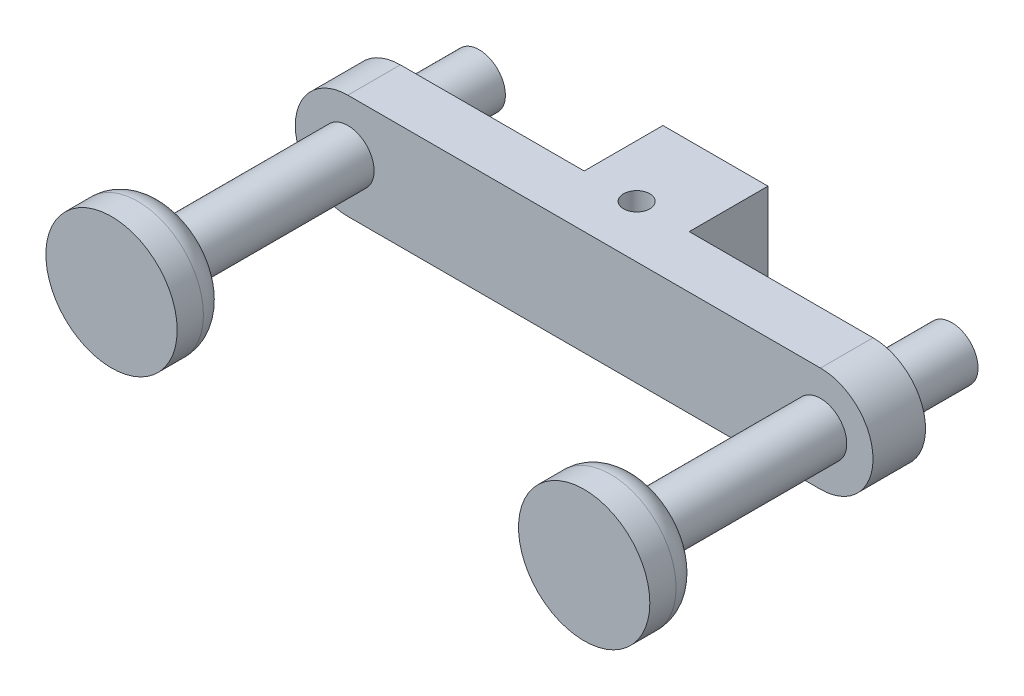
ISO-10303-21;
HEADER;
FILE_DESCRIPTION(('STEP AP214'),'2;1');
FILE_NAME('part.step','',(''),(''),'','','');
FILE_SCHEMA(('AUTOMOTIVE_DESIGN { 1 0 10303 214 1 1 1 1 }'));
ENDSEC;
DATA;
#1=APPLICATION_CONTEXT('core data for automotive mechanical design processes');
#2=APPLICATION_PROTOCOL_DEFINITION('international standard','automotive_design',2000,#1);
#3=PRODUCT_CONTEXT('',#1,'mechanical');
#4=PRODUCT('Part','Part','',(#3));
#5=PRODUCT_RELATED_PRODUCT_CATEGORY('part','',(#4));
#6=PRODUCT_DEFINITION_FORMATION('','',#4);
#7=PRODUCT_DEFINITION_CONTEXT('part definition',#1,'design');
#8=PRODUCT_DEFINITION('design','',#6,#7);
#9=PRODUCT_DEFINITION_SHAPE('','',#8);
#10=(LENGTH_UNIT() NAMED_UNIT(*) SI_UNIT(.MILLI.,.METRE.));
#11=(NAMED_UNIT(*) PLANE_ANGLE_UNIT() SI_UNIT($,.RADIAN.));
#12=(NAMED_UNIT(*) SI_UNIT($,.STERADIAN.) SOLID_ANGLE_UNIT());
#13=UNCERTAINTY_MEASURE_WITH_UNIT(LENGTH_MEASURE(1.E-05),#10,'distance_accuracy_value','');
#14=(GEOMETRIC_REPRESENTATION_CONTEXT(3) GLOBAL_UNCERTAINTY_ASSIGNED_CONTEXT((#13)) GLOBAL_UNIT_ASSIGNED_CONTEXT((#10,
#11,#12)) REPRESENTATION_CONTEXT('',''));
#15=CARTESIAN_POINT('',(0.,0.,0.));
#16=DIRECTION('',(0.,0.,1.));
#17=DIRECTION('',(1.,0.,0.));
#18=AXIS2_PLACEMENT_3D('',#15,#16,#17);
#19=CARTESIAN_POINT('',(-114.3,0.,0.));
#20=DIRECTION('',(0.,0.,1.));
#21=DIRECTION('',(1.,0.,0.));
#22=AXIS2_PLACEMENT_3D('',#19,#20,#21);
#23=PLANE('',#22);
#24=CARTESIAN_POINT('',(114.3,0.,0.));
#25=DIRECTION('',(0.,0.,1.));
#26=DIRECTION('',(1.,0.,0.));
#27=AXIS2_PLACEMENT_3D('',#24,#25,#26);
#28=CIRCLE('',#27,12.7);
#29=CARTESIAN_POINT('',(101.6,0.,0.));
#30=VERTEX_POINT('',#29);
#31=EDGE_CURVE('E264',#30,#30,#28,.T.);
#32=ORIENTED_EDGE('',*,*,#31,.T.);
#33=EDGE_LOOP('',(#32));
#34=FACE_BOUND('',#33,.T.);
#35=DIRECTION('',(0.,-1.,0.));
#36=VECTOR('',#35,1.);
#37=CARTESIAN_POINT('',(25.4,25.4,0.));
#38=LINE('',#37,#36);
#39=CARTESIAN_POINT('',(25.4,25.4,0.));
#40=VERTEX_POINT('',#39);
#41=CARTESIAN_POINT('',(25.4,-25.4,0.));
#42=VERTEX_POINT('',#41);
#43=EDGE_CURVE('E110',#40,#42,#38,.T.);
#44=ORIENTED_EDGE('',*,*,#43,.F.);
#45=DIRECTION('',(-1.,0.,0.));
#46=VECTOR('',#45,1.);
#47=CARTESIAN_POINT('',(-114.3,25.4,0.));
#48=LINE('',#47,#46);
#49=CARTESIAN_POINT('',(114.3,25.4,0.));
#50=VERTEX_POINT('',#49);
#51=EDGE_CURVE('E175',#50,#40,#48,.T.);
#52=ORIENTED_EDGE('',*,*,#51,.F.);
#53=CARTESIAN_POINT('',(114.3,0.,0.));
#54=DIRECTION('',(0.,0.,1.));
#55=DIRECTION('',(1.,0.,0.));
#56=AXIS2_PLACEMENT_3D('',#53,#54,#55);
#57=CIRCLE('',#56,25.4);
#58=CARTESIAN_POINT('',(114.3,-25.4,0.));
#59=VERTEX_POINT('',#58);
#60=EDGE_CURVE('E112',#59,#50,#57,.T.);
#61=ORIENTED_EDGE('',*,*,#60,.F.);
#62=DIRECTION('',(1.,0.,0.));
#63=VECTOR('',#62,1.);
#64=CARTESIAN_POINT('',(114.3,-25.4,0.));
#65=LINE('',#64,#63);
#66=EDGE_CURVE('E107',#42,#59,#65,.T.);
#67=ORIENTED_EDGE('',*,*,#66,.F.);
#68=EDGE_LOOP('',(#44,#52,#61,#67));
#69=FACE_BOUND('',#68,.T.);
#70=ADVANCED_FACE('F43',(#34,#69),#23,.F.);
#71=CARTESIAN_POINT('',(-114.3,0.,25.4));
#72=DIRECTION('',(0.,0.,1.));
#73=DIRECTION('',(1.,0.,0.));
#74=AXIS2_PLACEMENT_3D('',#71,#72,#73);
#75=PLANE('',#74);
#76=CARTESIAN_POINT('',(-114.3,0.,25.4));
#77=DIRECTION('',(0.,0.,1.));
#78=DIRECTION('',(1.,0.,0.));
#79=AXIS2_PLACEMENT_3D('',#76,#77,#78);
#80=CIRCLE('',#79,12.7);
#81=CARTESIAN_POINT('',(-127.,0.,25.4));
#82=VERTEX_POINT('',#81);
#83=EDGE_CURVE('E166',#82,#82,#80,.T.);
#84=ORIENTED_EDGE('',*,*,#83,.F.);
#85=EDGE_LOOP('',(#84));
#86=FACE_BOUND('',#85,.T.);
#87=CARTESIAN_POINT('',(-114.3,0.,25.4));
#88=DIRECTION('',(0.,0.,1.));
#89=DIRECTION('',(1.,0.,0.));
#90=AXIS2_PLACEMENT_3D('',#87,#88,#89);
#91=CIRCLE('',#90,25.4);
#92=CARTESIAN_POINT('',(-114.3,25.4,25.4));
#93=VERTEX_POINT('',#92);
#94=CARTESIAN_POINT('',(-114.3,-25.4,25.4));
#95=VERTEX_POINT('',#94);
#96=EDGE_CURVE('E170',#93,#95,#91,.T.);
#97=ORIENTED_EDGE('',*,*,#96,.T.);
#98=DIRECTION('',(1.,0.,0.));
#99=VECTOR('',#98,1.);
#100=CARTESIAN_POINT('',(114.3,-25.4,25.4));
#101=LINE('',#100,#99);
#102=CARTESIAN_POINT('',(114.3,-25.4,25.4));
#103=VERTEX_POINT('',#102);
#104=EDGE_CURVE('E174',#95,#103,#101,.T.);
#105=ORIENTED_EDGE('',*,*,#104,.T.);
#106=CARTESIAN_POINT('',(114.3,0.,25.4));
#107=DIRECTION('',(0.,0.,1.));
#108=DIRECTION('',(1.,0.,0.));
#109=AXIS2_PLACEMENT_3D('',#106,#107,#108);
#110=CIRCLE('',#109,25.4);
#111=CARTESIAN_POINT('',(114.3,25.4,25.4));
#112=VERTEX_POINT('',#111);
#113=EDGE_CURVE('E178',#103,#112,#110,.T.);
#114=ORIENTED_EDGE('',*,*,#113,.T.);
#115=DIRECTION('',(-1.,0.,0.));
#116=VECTOR('',#115,1.);
#117=CARTESIAN_POINT('',(-114.3,25.4,25.4));
#118=LINE('',#117,#116);
#119=EDGE_CURVE('E181',#112,#93,#118,.T.);
#120=ORIENTED_EDGE('',*,*,#119,.T.);
#121=EDGE_LOOP('',(#97,#105,#114,#120));
#122=FACE_BOUND('',#121,.T.);
#123=CARTESIAN_POINT('',(114.3,0.,25.4));
#124=DIRECTION('',(0.,0.,1.));
#125=DIRECTION('',(1.,0.,0.));
#126=AXIS2_PLACEMENT_3D('',#123,#124,#125);
#127=CIRCLE('',#126,12.7);
#128=CARTESIAN_POINT('',(101.6,0.,25.4));
#129=VERTEX_POINT('',#128);
#130=EDGE_CURVE('E162',#129,#129,#127,.T.);
#131=ORIENTED_EDGE('',*,*,#130,.F.);
#132=EDGE_LOOP('',(#131));
#133=FACE_BOUND('',#132,.T.);
#134=ADVANCED_FACE('F231',(#86,#122,#133),#75,.T.);
#135=CARTESIAN_POINT('',(-25.4,25.4,0.));
#136=VERTEX_POINT('',#135);
#137=CARTESIAN_POINT('',(-114.3,25.4,0.));
#138=VERTEX_POINT('',#137);
#139=EDGE_CURVE('E64',#136,#138,#48,.T.);
#140=ORIENTED_EDGE('',*,*,#139,.F.);
#141=DIRECTION('',(0.,-1.,0.));
#142=VECTOR('',#141,1.);
#143=CARTESIAN_POINT('',(-25.4,25.4,0.));
#144=LINE('',#143,#142);
#145=CARTESIAN_POINT('',(-25.4,-25.4,0.));
#146=VERTEX_POINT('',#145);
#147=EDGE_CURVE('E59',#136,#146,#144,.T.);
#148=ORIENTED_EDGE('',*,*,#147,.T.);
#149=CARTESIAN_POINT('',(-114.3,-25.4,0.));
#150=VERTEX_POINT('',#149);
#151=EDGE_CURVE('E118',#150,#146,#65,.T.);
#152=ORIENTED_EDGE('',*,*,#151,.F.);
#153=CARTESIAN_POINT('',(-114.3,0.,0.));
#154=DIRECTION('',(0.,0.,1.));
#155=DIRECTION('',(1.,0.,0.));
#156=AXIS2_PLACEMENT_3D('',#153,#154,#155);
#157=CIRCLE('',#156,25.4);
#158=EDGE_CURVE('E119',#138,#150,#157,.T.);
#159=ORIENTED_EDGE('',*,*,#158,.F.);
#160=EDGE_LOOP('',(#140,#148,#152,#159));
#161=FACE_BOUND('',#160,.T.);
#162=CARTESIAN_POINT('',(-114.3,0.,0.));
#163=DIRECTION('',(0.,0.,1.));
#164=DIRECTION('',(1.,0.,0.));
#165=AXIS2_PLACEMENT_3D('',#162,#163,#164);
#166=CIRCLE('',#165,12.7);
#167=CARTESIAN_POINT('',(-127.,0.,0.));
#168=VERTEX_POINT('',#167);
#169=EDGE_CURVE('E252',#168,#168,#166,.T.);
#170=ORIENTED_EDGE('',*,*,#169,.T.);
#171=EDGE_LOOP('',(#170));
#172=FACE_BOUND('',#171,.T.);
#173=ADVANCED_FACE('F234',(#161,#172),#23,.F.);
#174=CARTESIAN_POINT('',(-114.3,0.,25.4));
#175=DIRECTION('',(0.,0.,-1.));
#176=DIRECTION('',(-1.,0.,0.));
#177=AXIS2_PLACEMENT_3D('',#174,#175,#176);
#178=CYLINDRICAL_SURFACE('',#177,25.4);
#179=ORIENTED_EDGE('',*,*,#158,.T.);
#180=DIRECTION('',(0.,0.,-1.));
#181=VECTOR('',#180,1.);
#182=CARTESIAN_POINT('',(-114.3,-25.4,25.4));
#183=LINE('',#182,#181);
#184=EDGE_CURVE('E203',#95,#150,#183,.T.);
#185=ORIENTED_EDGE('',*,*,#184,.F.);
#186=ORIENTED_EDGE('',*,*,#96,.F.);
#187=DIRECTION('',(0.,0.,-1.));
#188=VECTOR('',#187,1.);
#189=CARTESIAN_POINT('',(-114.3,25.4,25.4));
#190=LINE('',#189,#188);
#191=EDGE_CURVE('E184',#93,#138,#190,.T.);
#192=ORIENTED_EDGE('',*,*,#191,.T.);
#193=EDGE_LOOP('',(#179,#185,#186,#192));
#194=FACE_BOUND('',#193,.T.);
#195=ADVANCED_FACE('F243',(#194),#178,.T.);
#196=CARTESIAN_POINT('',(114.3,-25.4,25.4));
#197=DIRECTION('',(0.,1.,0.));
#198=DIRECTION('',(0.,0.,1.));
#199=AXIS2_PLACEMENT_3D('',#196,#197,#198);
#200=PLANE('',#199);
#201=CARTESIAN_POINT('',(0.,-25.4,0.));
#202=DIRECTION('',(0.,1.,0.));
#203=DIRECTION('',(0.,0.,1.));
#204=AXIS2_PLACEMENT_3D('',#201,#202,#203);
#205=CIRCLE('',#204,6.35);
#206=CARTESIAN_POINT('',(0.,-25.4,6.35));
#207=VERTEX_POINT('',#206);
#208=EDGE_CURVE('E144',#207,#207,#205,.T.);
#209=ORIENTED_EDGE('',*,*,#208,.T.);
#210=EDGE_LOOP('',(#209));
#211=FACE_BOUND('',#210,.T.);
#212=ORIENTED_EDGE('',*,*,#151,.T.);
#213=DIRECTION('',(0.,0.,1.));
#214=VECTOR('',#213,1.);
#215=CARTESIAN_POINT('',(-25.4,-25.4,-38.1));
#216=LINE('',#215,#214);
#217=CARTESIAN_POINT('',(-25.4,-25.4,-38.1));
#218=VERTEX_POINT('',#217);
#219=EDGE_CURVE('E137',#218,#146,#216,.T.);
#220=ORIENTED_EDGE('',*,*,#219,.F.);
#221=DIRECTION('',(-1.,0.,0.));
#222=VECTOR('',#221,1.);
#223=CARTESIAN_POINT('',(25.4,-25.4,-38.1));
#224=LINE('',#223,#222);
#225=CARTESIAN_POINT('',(25.4,-25.4,-38.1));
#226=VERTEX_POINT('',#225);
#227=EDGE_CURVE('E135',#226,#218,#224,.T.);
#228=ORIENTED_EDGE('',*,*,#227,.F.);
#229=DIRECTION('',(0.,0.,-1.));
#230=VECTOR('',#229,1.);
#231=CARTESIAN_POINT('',(25.4,-25.4,-38.1));
#232=LINE('',#231,#230);
#233=EDGE_CURVE('E126',#42,#226,#232,.T.);
#234=ORIENTED_EDGE('',*,*,#233,.F.);
#235=ORIENTED_EDGE('',*,*,#66,.T.);
#236=DIRECTION('',(0.,0.,-1.));
#237=VECTOR('',#236,1.);
#238=CARTESIAN_POINT('',(114.3,-25.4,25.4));
#239=LINE('',#238,#237);
#240=EDGE_CURVE('E200',#103,#59,#239,.T.);
#241=ORIENTED_EDGE('',*,*,#240,.F.);
#242=ORIENTED_EDGE('',*,*,#104,.F.);
#243=ORIENTED_EDGE('',*,*,#184,.T.);
#244=EDGE_LOOP('',(#212,#220,#228,#234,#235,#241,#242,#243));
#245=FACE_BOUND('',#244,.T.);
#246=ADVANCED_FACE('F132',(#211,#245),#200,.F.);
#247=CARTESIAN_POINT('',(114.3,0.,25.4));
#248=DIRECTION('',(0.,0.,-1.));
#249=DIRECTION('',(-1.,0.,0.));
#250=AXIS2_PLACEMENT_3D('',#247,#248,#249);
#251=CYLINDRICAL_SURFACE('',#250,25.4);
#252=ORIENTED_EDGE('',*,*,#60,.T.);
#253=DIRECTION('',(0.,0.,-1.));
#254=VECTOR('',#253,1.);
#255=CARTESIAN_POINT('',(114.3,25.4,25.4));
#256=LINE('',#255,#254);
#257=EDGE_CURVE('E196',#112,#50,#256,.T.);
#258=ORIENTED_EDGE('',*,*,#257,.F.);
#259=ORIENTED_EDGE('',*,*,#113,.F.);
#260=ORIENTED_EDGE('',*,*,#240,.T.);
#261=EDGE_LOOP('',(#252,#258,#259,#260));
#262=FACE_BOUND('',#261,.T.);
#263=ADVANCED_FACE('F284',(#262),#251,.T.);
#264=CARTESIAN_POINT('',(-114.3,25.4,25.4));
#265=DIRECTION('',(0.,-1.,0.));
#266=DIRECTION('',(0.,0.,-1.));
#267=AXIS2_PLACEMENT_3D('',#264,#265,#266);
#268=PLANE('',#267);
#269=CARTESIAN_POINT('',(0.,25.4,0.));
#270=DIRECTION('',(0.,1.,0.));
#271=DIRECTION('',(0.,0.,1.));
#272=AXIS2_PLACEMENT_3D('',#269,#270,#271);
#273=CIRCLE('',#272,6.35);
#274=CARTESIAN_POINT('',(0.,25.4,6.35));
#275=VERTEX_POINT('',#274);
#276=EDGE_CURVE('E270',#275,#275,#273,.T.);
#277=ORIENTED_EDGE('',*,*,#276,.F.);
#278=EDGE_LOOP('',(#277));
#279=FACE_BOUND('',#278,.T.);
#280=ORIENTED_EDGE('',*,*,#51,.T.);
#281=DIRECTION('',(0.,0.,-1.));
#282=VECTOR('',#281,1.);
#283=CARTESIAN_POINT('',(25.4,25.4,-38.1));
#284=LINE('',#283,#282);
#285=CARTESIAN_POINT('',(25.4,25.4,-38.1));
#286=VERTEX_POINT('',#285);
#287=EDGE_CURVE('E128',#40,#286,#284,.T.);
#288=ORIENTED_EDGE('',*,*,#287,.T.);
#289=DIRECTION('',(-1.,0.,0.));
#290=VECTOR('',#289,1.);
#291=CARTESIAN_POINT('',(25.4,25.4,-38.1));
#292=LINE('',#291,#290);
#293=CARTESIAN_POINT('',(-25.4,25.4,-38.1));
#294=VERTEX_POINT('',#293);
#295=EDGE_CURVE('E152',#286,#294,#292,.T.);
#296=ORIENTED_EDGE('',*,*,#295,.T.);
#297=DIRECTION('',(0.,0.,1.));
#298=VECTOR('',#297,1.);
#299=CARTESIAN_POINT('',(-25.4,25.4,-38.1));
#300=LINE('',#299,#298);
#301=EDGE_CURVE('E141',#294,#136,#300,.T.);
#302=ORIENTED_EDGE('',*,*,#301,.T.);
#303=ORIENTED_EDGE('',*,*,#139,.T.);
#304=ORIENTED_EDGE('',*,*,#191,.F.);
#305=ORIENTED_EDGE('',*,*,#119,.F.);
#306=ORIENTED_EDGE('',*,*,#257,.T.);
#307=EDGE_LOOP('',(#280,#288,#296,#302,#303,#304,#305,#306));
#308=FACE_BOUND('',#307,.T.);
#309=ADVANCED_FACE('F280',(#279,#308),#268,.F.);
#310=CARTESIAN_POINT('',(-25.4,25.4,-38.1));
#311=DIRECTION('',(1.,0.,0.));
#312=DIRECTION('',(0.,0.,-1.));
#313=AXIS2_PLACEMENT_3D('',#310,#311,#312);
#314=PLANE('',#313);
#315=DIRECTION('',(0.,-1.,0.));
#316=VECTOR('',#315,1.);
#317=CARTESIAN_POINT('',(-25.4,25.4,-38.1));
#318=LINE('',#317,#316);
#319=EDGE_CURVE('E155',#294,#218,#318,.T.);
#320=ORIENTED_EDGE('',*,*,#319,.T.);
#321=ORIENTED_EDGE('',*,*,#219,.T.);
#322=ORIENTED_EDGE('',*,*,#147,.F.);
#323=ORIENTED_EDGE('',*,*,#301,.F.);
#324=EDGE_LOOP('',(#320,#321,#322,#323));
#325=FACE_BOUND('',#324,.T.);
#326=ADVANCED_FACE('F283',(#325),#314,.F.);
#327=CARTESIAN_POINT('',(25.4,25.4,-38.1));
#328=DIRECTION('',(-1.,0.,0.));
#329=DIRECTION('',(0.,0.,1.));
#330=AXIS2_PLACEMENT_3D('',#327,#328,#329);
#331=PLANE('',#330);
#332=ORIENTED_EDGE('',*,*,#43,.T.);
#333=ORIENTED_EDGE('',*,*,#233,.T.);
#334=DIRECTION('',(0.,-1.,0.));
#335=VECTOR('',#334,1.);
#336=CARTESIAN_POINT('',(25.4,25.4,-38.1));
#337=LINE('',#336,#335);
#338=EDGE_CURVE('E130',#286,#226,#337,.T.);
#339=ORIENTED_EDGE('',*,*,#338,.F.);
#340=ORIENTED_EDGE('',*,*,#287,.F.);
#341=EDGE_LOOP('',(#332,#333,#339,#340));
#342=FACE_BOUND('',#341,.T.);
#343=ADVANCED_FACE('F124',(#342),#331,.F.);
#344=CARTESIAN_POINT('',(25.4,25.4,-38.1));
#345=DIRECTION('',(0.,0.,1.));
#346=DIRECTION('',(1.,0.,0.));
#347=AXIS2_PLACEMENT_3D('',#344,#345,#346);
#348=PLANE('',#347);
#349=CARTESIAN_POINT('',(0.,0.,-38.1));
#350=DIRECTION('',(0.,0.,-1.));
#351=DIRECTION('',(-1.,0.,0.));
#352=AXIS2_PLACEMENT_3D('',#349,#350,#351);
#353=CIRCLE('',#352,12.7);
#354=CARTESIAN_POINT('',(-12.7,0.,-38.1));
#355=VERTEX_POINT('',#354);
#356=EDGE_CURVE('E255',#355,#355,#353,.T.);
#357=ORIENTED_EDGE('',*,*,#356,.F.);
#358=EDGE_LOOP('',(#357));
#359=FACE_BOUND('',#358,.T.);
#360=ORIENTED_EDGE('',*,*,#338,.T.);
#361=ORIENTED_EDGE('',*,*,#227,.T.);
#362=ORIENTED_EDGE('',*,*,#319,.F.);
#363=ORIENTED_EDGE('',*,*,#295,.F.);
#364=EDGE_LOOP('',(#360,#361,#362,#363));
#365=FACE_BOUND('',#364,.T.);
#366=ADVANCED_FACE('F299',(#359,#365),#348,.F.);
#367=CARTESIAN_POINT('',(0.,-25.4,0.));
#368=DIRECTION('',(0.,1.,0.));
#369=DIRECTION('',(0.,0.,1.));
#370=AXIS2_PLACEMENT_3D('',#367,#368,#369);
#371=CYLINDRICAL_SURFACE('',#370,6.35);
#372=ORIENTED_EDGE('',*,*,#208,.F.);
#373=EDGE_LOOP('',(#372));
#374=FACE_BOUND('',#373,.T.);
#375=ORIENTED_EDGE('',*,*,#276,.T.);
#376=EDGE_LOOP('',(#375));
#377=FACE_BOUND('',#376,.T.);
#378=ADVANCED_FACE('F278',(#374,#377),#371,.F.);
#379=CARTESIAN_POINT('',(0.,0.,-25.4));
#380=DIRECTION('',(0.,0.,-1.));
#381=DIRECTION('',(-1.,0.,0.));
#382=AXIS2_PLACEMENT_3D('',#379,#380,#381);
#383=CYLINDRICAL_SURFACE('',#382,12.7);
#384=CARTESIAN_POINT('',(0.,0.,-25.4));
#385=DIRECTION('',(0.,0.,-1.));
#386=DIRECTION('',(-1.,0.,0.));
#387=AXIS2_PLACEMENT_3D('',#384,#385,#386);
#388=CIRCLE('',#387,12.7);
#389=CARTESIAN_POINT('',(-12.7,0.,-25.4));
#390=VERTEX_POINT('',#389);
#391=EDGE_CURVE('E261',#390,#390,#388,.T.);
#392=ORIENTED_EDGE('',*,*,#391,.F.);
#393=EDGE_LOOP('',(#392));
#394=FACE_BOUND('',#393,.T.);
#395=ORIENTED_EDGE('',*,*,#356,.T.);
#396=EDGE_LOOP('',(#395));
#397=FACE_BOUND('',#396,.T.);
#398=ADVANCED_FACE('F308',(#394,#397),#383,.F.);
#399=CARTESIAN_POINT('',(0.,0.,-25.4));
#400=DIRECTION('',(0.,0.,-1.));
#401=DIRECTION('',(-1.,0.,0.));
#402=AXIS2_PLACEMENT_3D('',#399,#400,#401);
#403=PLANE('',#402);
#404=ORIENTED_EDGE('',*,*,#391,.T.);
#405=EDGE_LOOP('',(#404));
#406=FACE_BOUND('',#405,.T.);
#407=ADVANCED_FACE('F363',(#406),#403,.T.);
#408=CARTESIAN_POINT('',(-114.3,0.,-38.1));
#409=DIRECTION('',(0.,0.,-1.));
#410=DIRECTION('',(-1.,0.,0.));
#411=AXIS2_PLACEMENT_3D('',#408,#409,#410);
#412=PLANE('',#411);
#413=CARTESIAN_POINT('',(-114.3,0.,-38.1));
#414=DIRECTION('',(0.,0.,-1.));
#415=DIRECTION('',(-1.,0.,0.));
#416=AXIS2_PLACEMENT_3D('',#413,#414,#415);
#417=CIRCLE('',#416,12.7);
#418=CARTESIAN_POINT('',(-127.,0.,-38.1));
#419=VERTEX_POINT('',#418);
#420=EDGE_CURVE('E256',#419,#419,#417,.T.);
#421=ORIENTED_EDGE('',*,*,#420,.T.);
#422=EDGE_LOOP('',(#421));
#423=FACE_BOUND('',#422,.T.);
#424=ADVANCED_FACE('F373',(#423),#412,.T.);
#425=CARTESIAN_POINT('',(-114.3,0.,114.3));
#426=DIRECTION('',(0.,0.,-1.));
#427=DIRECTION('',(-1.,0.,0.));
#428=AXIS2_PLACEMENT_3D('',#425,#426,#427);
#429=CYLINDRICAL_SURFACE('',#428,12.7);
#430=CARTESIAN_POINT('',(-127.,0.,-38.1));
#431=CARTESIAN_POINT('',(-127.,0.,-37.703125));
#432=CARTESIAN_POINT('',(-127.,0.,-37.30625));
#433=CARTESIAN_POINT('',(-127.,0.,-36.5125));
#434=CARTESIAN_POINT('',(-127.,0.,-36.115625));
#435=CARTESIAN_POINT('',(-127.,0.,-35.321875));
#436=CARTESIAN_POINT('',(-127.,0.,-34.925));
#437=CARTESIAN_POINT('',(-127.,0.,-34.13125));
#438=CARTESIAN_POINT('',(-127.,0.,-33.734375));
#439=CARTESIAN_POINT('',(-127.,0.,-32.940625));
#440=CARTESIAN_POINT('',(-127.,0.,-32.54375));
#441=CARTESIAN_POINT('',(-127.,0.,-31.75));
#442=CARTESIAN_POINT('',(-127.,0.,-31.353125));
#443=CARTESIAN_POINT('',(-127.,0.,-30.559375));
#444=CARTESIAN_POINT('',(-127.,0.,-30.1625));
#445=CARTESIAN_POINT('',(-127.,0.,-29.36875));
#446=CARTESIAN_POINT('',(-127.,0.,-28.971875));
#447=CARTESIAN_POINT('',(-127.,0.,-28.178125));
#448=CARTESIAN_POINT('',(-127.,0.,-27.78125));
#449=CARTESIAN_POINT('',(-127.,0.,-26.9875));
#450=CARTESIAN_POINT('',(-127.,0.,-26.590625));
#451=CARTESIAN_POINT('',(-127.,0.,-25.796875));
#452=CARTESIAN_POINT('',(-127.,0.,-25.4));
#453=CARTESIAN_POINT('',(-127.,0.,-24.60625));
#454=CARTESIAN_POINT('',(-127.,0.,-24.209375));
#455=CARTESIAN_POINT('',(-127.,0.,-23.415625));
#456=CARTESIAN_POINT('',(-127.,0.,-23.01875));
#457=CARTESIAN_POINT('',(-127.,0.,-22.225));
#458=CARTESIAN_POINT('',(-127.,0.,-21.828125));
#459=CARTESIAN_POINT('',(-127.,0.,-21.034375));
#460=CARTESIAN_POINT('',(-127.,0.,-20.6375));
#461=CARTESIAN_POINT('',(-127.,0.,-19.84375));
#462=CARTESIAN_POINT('',(-127.,0.,-19.446875));
#463=CARTESIAN_POINT('',(-127.,0.,-18.653125));
#464=CARTESIAN_POINT('',(-127.,0.,-18.25625));
#465=CARTESIAN_POINT('',(-127.,0.,-17.4625));
#466=CARTESIAN_POINT('',(-127.,0.,-17.065625));
#467=CARTESIAN_POINT('',(-127.,0.,-16.271875));
#468=CARTESIAN_POINT('',(-127.,0.,-15.875));
#469=CARTESIAN_POINT('',(-127.,0.,-15.08125));
#470=CARTESIAN_POINT('',(-127.,0.,-14.684375));
#471=CARTESIAN_POINT('',(-127.,0.,-13.890625));
#472=CARTESIAN_POINT('',(-127.,0.,-13.49375));
#473=CARTESIAN_POINT('',(-127.,0.,-12.7));
#474=CARTESIAN_POINT('',(-127.,0.,-12.303125));
#475=CARTESIAN_POINT('',(-127.,0.,-11.509375));
#476=CARTESIAN_POINT('',(-127.,0.,-11.1125));
#477=CARTESIAN_POINT('',(-127.,0.,-10.31875));
#478=CARTESIAN_POINT('',(-127.,0.,-9.92187500000001));
#479=CARTESIAN_POINT('',(-127.,0.,-9.12812500000001));
#480=CARTESIAN_POINT('',(-127.,0.,-8.73125));
#481=CARTESIAN_POINT('',(-127.,0.,-7.93750000000001));
#482=CARTESIAN_POINT('',(-127.,0.,-7.540625));
#483=CARTESIAN_POINT('',(-127.,0.,-6.74687500000001));
#484=CARTESIAN_POINT('',(-127.,0.,-6.35000000000001));
#485=CARTESIAN_POINT('',(-127.,0.,-5.55625000000002));
#486=CARTESIAN_POINT('',(-127.,0.,-5.15937500000002));
#487=CARTESIAN_POINT('',(-127.,0.,-4.36562500000002));
#488=CARTESIAN_POINT('',(-127.,0.,-3.96875000000002));
#489=CARTESIAN_POINT('',(-127.,0.,-3.17500000000002));
#490=CARTESIAN_POINT('',(-127.,0.,-2.77812500000002));
#491=CARTESIAN_POINT('',(-127.,0.,-1.98437500000002));
#492=CARTESIAN_POINT('',(-127.,0.,-1.58750000000001));
#493=CARTESIAN_POINT('',(-127.,0.,-0.793750000000014));
#494=CARTESIAN_POINT('',(-127.,0.,-0.396875000000014));
#495=CARTESIAN_POINT('',(-127.,0.,0.));
#496=B_SPLINE_CURVE_WITH_KNOTS('',3,(#430,#431,#432,#433,#434,#435,#436,#437,#438,#439,#440,
#441,#442,#443,#444,#445,#446,#447,#448,#449,#450,#451,#452,#453,#454,#455,#456,#457,#458,#459,
#460,#461,#462,#463,#464,#465,#466,#467,#468,#469,#470,#471,#472,#473,#474,#475,#476,#477,#478,
#479,#480,#481,#482,#483,#484,#485,#486,#487,#488,#489,#490,#491,#492,#493,#494,#495),
.UNSPECIFIED.,.F.,.F.,(4,2,2,2,2,2,2,2,2,2,2,2,2,2,2,2,2,2,2,2,2,2,2,2,2,2,2,2,2,2,2,2,4),(0.,
1.190625,2.38125,3.571875,4.7625,5.953125,7.14375,8.334375,9.52500000000001,10.715625,11.90625,
13.096875,14.2875,15.478125,16.66875,17.859375,19.05,20.240625,21.43125,22.621875,23.8125,
25.003125,26.19375,27.384375,28.575,29.765625,30.95625,32.146875,33.3374999999999,34.528125,
35.71875,36.909375,38.1),.UNSPECIFIED.);
#497=EDGE_CURVE('BSEAM384',#419,#168,#496,.T.);
#498=ORIENTED_EDGE('',*,*,#420,.F.);
#499=ORIENTED_EDGE('',*,*,#169,.F.);
#500=ORIENTED_EDGE('',*,*,#497,.T.);
#501=ORIENTED_EDGE('',*,*,#497,.F.);
#502=EDGE_LOOP('',(#498,#500,#499,#501));
#503=FACE_BOUND('',#502,.T.);
#504=ADVANCED_FACE('F384',(#503),#429,.T.);
#505=CARTESIAN_POINT('',(-114.3,0.,114.3));
#506=DIRECTION('',(0.,0.,-1.));
#507=DIRECTION('',(-1.,0.,0.));
#508=AXIS2_PLACEMENT_3D('',#505,#506,#507);
#509=CIRCLE('',#508,12.7);
#510=CARTESIAN_POINT('',(-127.,0.,114.3));
#511=VERTEX_POINT('',#510);
#512=EDGE_CURVE('E597',#511,#511,#509,.T.);
#513=CARTESIAN_POINT('',(-127.,0.,25.4));
#514=CARTESIAN_POINT('',(-127.,0.,26.3260416666667));
#515=CARTESIAN_POINT('',(-127.,0.,27.2520833333333));
#516=CARTESIAN_POINT('',(-127.,0.,29.1041666666667));
#517=CARTESIAN_POINT('',(-127.,0.,30.0302083333333));
#518=CARTESIAN_POINT('',(-127.,0.,31.8822916666667));
#519=CARTESIAN_POINT('',(-127.,0.,32.8083333333333));
#520=CARTESIAN_POINT('',(-127.,0.,34.6604166666667));
#521=CARTESIAN_POINT('',(-127.,0.,35.5864583333333));
#522=CARTESIAN_POINT('',(-127.,0.,37.4385416666667));
#523=CARTESIAN_POINT('',(-127.,0.,38.3645833333333));
#524=CARTESIAN_POINT('',(-127.,0.,40.2166666666667));
#525=CARTESIAN_POINT('',(-127.,0.,41.1427083333333));
#526=CARTESIAN_POINT('',(-127.,0.,42.9947916666667));
#527=CARTESIAN_POINT('',(-127.,0.,43.9208333333333));
#528=CARTESIAN_POINT('',(-127.,0.,45.7729166666667));
#529=CARTESIAN_POINT('',(-127.,0.,46.6989583333333));
#530=CARTESIAN_POINT('',(-127.,0.,48.5510416666667));
#531=CARTESIAN_POINT('',(-127.,0.,49.4770833333333));
#532=CARTESIAN_POINT('',(-127.,0.,51.3291666666667));
#533=CARTESIAN_POINT('',(-127.,0.,52.2552083333333));
#534=CARTESIAN_POINT('',(-127.,0.,54.1072916666667));
#535=CARTESIAN_POINT('',(-127.,0.,55.0333333333333));
#536=CARTESIAN_POINT('',(-127.,0.,56.8854166666667));
#537=CARTESIAN_POINT('',(-127.,0.,57.8114583333333));
#538=CARTESIAN_POINT('',(-127.,0.,59.6635416666667));
#539=CARTESIAN_POINT('',(-127.,0.,60.5895833333334));
#540=CARTESIAN_POINT('',(-127.,0.,62.4416666666667));
#541=CARTESIAN_POINT('',(-127.,0.,63.3677083333333));
#542=CARTESIAN_POINT('',(-127.,0.,65.2197916666667));
#543=CARTESIAN_POINT('',(-127.,0.,66.1458333333334));
#544=CARTESIAN_POINT('',(-127.,0.,67.9979166666667));
#545=CARTESIAN_POINT('',(-127.,0.,68.9239583333334));
#546=CARTESIAN_POINT('',(-127.,0.,70.7760416666667));
#547=CARTESIAN_POINT('',(-127.,0.,71.7020833333333));
#548=CARTESIAN_POINT('',(-127.,0.,73.5541666666667));
#549=CARTESIAN_POINT('',(-127.,0.,74.4802083333334));
#550=CARTESIAN_POINT('',(-127.,0.,76.3322916666667));
#551=CARTESIAN_POINT('',(-127.,0.,77.2583333333334));
#552=CARTESIAN_POINT('',(-127.,0.,79.1104166666667));
#553=CARTESIAN_POINT('',(-127.,0.,80.0364583333334));
#554=CARTESIAN_POINT('',(-127.,0.,81.8885416666667));
#555=CARTESIAN_POINT('',(-127.,0.,82.8145833333334));
#556=CARTESIAN_POINT('',(-127.,0.,84.6666666666667));
#557=CARTESIAN_POINT('',(-127.,0.,85.5927083333334));
#558=CARTESIAN_POINT('',(-127.,0.,87.4447916666667));
#559=CARTESIAN_POINT('',(-127.,0.,88.3708333333334));
#560=CARTESIAN_POINT('',(-127.,0.,90.2229166666667));
#561=CARTESIAN_POINT('',(-127.,0.,91.1489583333334));
#562=CARTESIAN_POINT('',(-127.,0.,93.0010416666667));
#563=CARTESIAN_POINT('',(-127.,0.,93.9270833333334));
#564=CARTESIAN_POINT('',(-127.,0.,95.7791666666667));
#565=CARTESIAN_POINT('',(-127.,0.,96.7052083333334));
#566=CARTESIAN_POINT('',(-127.,0.,98.5572916666667));
#567=CARTESIAN_POINT('',(-127.,0.,99.4833333333334));
#568=CARTESIAN_POINT('',(-127.,0.,101.335416666667));
#569=CARTESIAN_POINT('',(-127.,0.,102.261458333333));
#570=CARTESIAN_POINT('',(-127.,0.,104.113541666667));
#571=CARTESIAN_POINT('',(-127.,0.,105.039583333333));
#572=CARTESIAN_POINT('',(-127.,0.,106.891666666667));
#573=CARTESIAN_POINT('',(-127.,0.,107.817708333333));
#574=CARTESIAN_POINT('',(-127.,0.,109.669791666667));
#575=CARTESIAN_POINT('',(-127.,0.,110.595833333333));
#576=CARTESIAN_POINT('',(-127.,0.,112.447916666667));
#577=CARTESIAN_POINT('',(-127.,0.,113.373958333333));
#578=CARTESIAN_POINT('',(-127.,0.,114.3));
#579=B_SPLINE_CURVE_WITH_KNOTS('',3,(#513,#514,#515,#516,#517,#518,#519,#520,#521,#522,#523,
#524,#525,#526,#527,#528,#529,#530,#531,#532,#533,#534,#535,#536,#537,#538,#539,#540,#541,#542,
#543,#544,#545,#546,#547,#548,#549,#550,#551,#552,#553,#554,#555,#556,#557,#558,#559,#560,#561,
#562,#563,#564,#565,#566,#567,#568,#569,#570,#571,#572,#573,#574,#575,#576,#577,#578),
.UNSPECIFIED.,.F.,.F.,(4,2,2,2,2,2,2,2,2,2,2,2,2,2,2,2,2,2,2,2,2,2,2,2,2,2,2,2,2,2,2,2,4),(0.,
2.77812500000001,5.55625,8.334375,11.1125,13.890625,16.66875,19.446875,22.225,25.003125,
27.78125,30.559375,33.3375,36.115625,38.89375,41.671875,44.45,47.228125,50.00625,52.784375,
55.5625,58.340625,61.11875,63.896875,66.675,69.453125,72.23125,75.009375,77.7875000000001,
80.5656250000001,83.3437500000001,86.1218750000001,88.9000000000001),.UNSPECIFIED.);
#580=EDGE_CURVE('BSEAM395',#82,#511,#579,.T.);
#581=ORIENTED_EDGE('',*,*,#83,.T.);
#582=ORIENTED_EDGE('',*,*,#512,.T.);
#583=ORIENTED_EDGE('',*,*,#580,.T.);
#584=ORIENTED_EDGE('',*,*,#580,.F.);
#585=EDGE_LOOP('',(#581,#583,#582,#584));
#586=FACE_BOUND('',#585,.T.);
#587=ADVANCED_FACE('F395',(#586),#429,.T.);
#588=CARTESIAN_POINT('',(114.3,0.,114.3));
#589=DIRECTION('',(0.,0.,-1.));
#590=DIRECTION('',(-1.,0.,0.));
#591=AXIS2_PLACEMENT_3D('',#588,#589,#590);
#592=CYLINDRICAL_SURFACE('',#591,12.7);
#593=CARTESIAN_POINT('',(114.3,0.,114.3));
#594=DIRECTION('',(0.,0.,-1.));
#595=DIRECTION('',(-1.,0.,0.));
#596=AXIS2_PLACEMENT_3D('',#593,#594,#595);
#597=CIRCLE('',#596,12.7);
#598=CARTESIAN_POINT('',(101.6,0.,114.3));
#599=VERTEX_POINT('',#598);
#600=EDGE_CURVE('E588',#599,#599,#597,.T.);
#601=CARTESIAN_POINT('',(101.6,0.,25.4));
#602=CARTESIAN_POINT('',(101.6,0.,26.3260416666667));
#603=CARTESIAN_POINT('',(101.6,0.,27.2520833333333));
#604=CARTESIAN_POINT('',(101.6,0.,29.1041666666667));
#605=CARTESIAN_POINT('',(101.6,0.,30.0302083333333));
#606=CARTESIAN_POINT('',(101.6,0.,31.8822916666667));
#607=CARTESIAN_POINT('',(101.6,0.,32.8083333333333));
#608=CARTESIAN_POINT('',(101.6,0.,34.6604166666667));
#609=CARTESIAN_POINT('',(101.6,0.,35.5864583333333));
#610=CARTESIAN_POINT('',(101.6,0.,37.4385416666667));
#611=CARTESIAN_POINT('',(101.6,0.,38.3645833333333));
#612=CARTESIAN_POINT('',(101.6,0.,40.2166666666667));
#613=CARTESIAN_POINT('',(101.6,0.,41.1427083333333));
#614=CARTESIAN_POINT('',(101.6,0.,42.9947916666667));
#615=CARTESIAN_POINT('',(101.6,0.,43.9208333333333));
#616=CARTESIAN_POINT('',(101.6,0.,45.7729166666667));
#617=CARTESIAN_POINT('',(101.6,0.,46.6989583333333));
#618=CARTESIAN_POINT('',(101.6,0.,48.5510416666667));
#619=CARTESIAN_POINT('',(101.6,0.,49.4770833333333));
#620=CARTESIAN_POINT('',(101.6,0.,51.3291666666667));
#621=CARTESIAN_POINT('',(101.6,0.,52.2552083333333));
#622=CARTESIAN_POINT('',(101.6,0.,54.1072916666666));
#623=CARTESIAN_POINT('',(101.6,0.,55.0333333333333));
#624=CARTESIAN_POINT('',(101.6,0.,56.8854166666667));
#625=CARTESIAN_POINT('',(101.6,0.,57.8114583333333));
#626=CARTESIAN_POINT('',(101.6,0.,59.6635416666667));
#627=CARTESIAN_POINT('',(101.6,0.,60.5895833333333));
#628=CARTESIAN_POINT('',(101.6,0.,62.4416666666667));
#629=CARTESIAN_POINT('',(101.6,0.,63.3677083333333));
#630=CARTESIAN_POINT('',(101.6,0.,65.2197916666667));
#631=CARTESIAN_POINT('',(101.6,0.,66.1458333333333));
#632=CARTESIAN_POINT('',(101.6,0.,67.9979166666666));
#633=CARTESIAN_POINT('',(101.6,0.,68.9239583333333));
#634=CARTESIAN_POINT('',(101.6,0.,70.7760416666667));
#635=CARTESIAN_POINT('',(101.6,0.,71.7020833333333));
#636=CARTESIAN_POINT('',(101.6,0.,73.5541666666667));
#637=CARTESIAN_POINT('',(101.6,0.,74.4802083333333));
#638=CARTESIAN_POINT('',(101.6,0.,76.3322916666666));
#639=CARTESIAN_POINT('',(101.6,0.,77.2583333333333));
#640=CARTESIAN_POINT('',(101.6,0.,79.1104166666666));
#641=CARTESIAN_POINT('',(101.6,0.,80.0364583333333));
#642=CARTESIAN_POINT('',(101.6,0.,81.8885416666667));
#643=CARTESIAN_POINT('',(101.6,0.,82.8145833333333));
#644=CARTESIAN_POINT('',(101.6,0.,84.6666666666666));
#645=CARTESIAN_POINT('',(101.6,0.,85.5927083333333));
#646=CARTESIAN_POINT('',(101.6,0.,87.4447916666666));
#647=CARTESIAN_POINT('',(101.6,0.,88.3708333333333));
#648=CARTESIAN_POINT('',(101.6,0.,90.2229166666666));
#649=CARTESIAN_POINT('',(101.6,0.,91.1489583333333));
#650=CARTESIAN_POINT('',(101.6,0.,93.0010416666667));
#651=CARTESIAN_POINT('',(101.6,0.,93.9270833333333));
#652=CARTESIAN_POINT('',(101.6,0.,95.7791666666666));
#653=CARTESIAN_POINT('',(101.6,0.,96.7052083333333));
#654=CARTESIAN_POINT('',(101.6,0.,98.5572916666666));
#655=CARTESIAN_POINT('',(101.6,0.,99.4833333333333));
#656=CARTESIAN_POINT('',(101.6,0.,101.335416666667));
#657=CARTESIAN_POINT('',(101.6,0.,102.261458333333));
#658=CARTESIAN_POINT('',(101.6,0.,104.113541666667));
#659=CARTESIAN_POINT('',(101.6,0.,105.039583333333));
#660=CARTESIAN_POINT('',(101.6,0.,106.891666666667));
#661=CARTESIAN_POINT('',(101.6,0.,107.817708333333));
#662=CARTESIAN_POINT('',(101.6,0.,109.669791666667));
#663=CARTESIAN_POINT('',(101.6,0.,110.595833333333));
#664=CARTESIAN_POINT('',(101.6,0.,112.447916666667));
#665=CARTESIAN_POINT('',(101.6,0.,113.373958333333));
#666=CARTESIAN_POINT('',(101.6,0.,114.3));
#667=B_SPLINE_CURVE_WITH_KNOTS('',3,(#601,#602,#603,#604,#605,#606,#607,#608,#609,#610,#611,
#612,#613,#614,#615,#616,#617,#618,#619,#620,#621,#622,#623,#624,#625,#626,#627,#628,#629,#630,
#631,#632,#633,#634,#635,#636,#637,#638,#639,#640,#641,#642,#643,#644,#645,#646,#647,#648,#649,
#650,#651,#652,#653,#654,#655,#656,#657,#658,#659,#660,#661,#662,#663,#664,#665,#666),
.UNSPECIFIED.,.F.,.F.,(4,2,2,2,2,2,2,2,2,2,2,2,2,2,2,2,2,2,2,2,2,2,2,2,2,2,2,2,2,2,2,2,4),(0.,
2.77812500000001,5.55625,8.334375,11.1125,13.890625,16.66875,19.446875,22.225,25.003125,
27.78125,30.559375,33.3375,36.115625,38.89375,41.671875,44.45,47.228125,50.00625,52.784375,
55.5625,58.340625,61.11875,63.896875,66.675,69.453125,72.23125,75.009375,77.7875,80.565625,
83.34375,86.121875,88.9),.UNSPECIFIED.);
#668=EDGE_CURVE('BSEAM406',#129,#599,#667,.T.);
#669=ORIENTED_EDGE('',*,*,#130,.T.);
#670=ORIENTED_EDGE('',*,*,#600,.T.);
#671=ORIENTED_EDGE('',*,*,#668,.T.);
#672=ORIENTED_EDGE('',*,*,#668,.F.);
#673=EDGE_LOOP('',(#669,#671,#670,#672));
#674=FACE_BOUND('',#673,.T.);
#675=ADVANCED_FACE('F406',(#674),#592,.T.);
#676=CARTESIAN_POINT('',(114.3,0.,-38.1000000000001));
#677=DIRECTION('',(0.,0.,-1.));
#678=DIRECTION('',(-1.,0.,0.));
#679=AXIS2_PLACEMENT_3D('',#676,#677,#678);
#680=CIRCLE('',#679,12.7);
#681=CARTESIAN_POINT('',(101.6,0.,-38.1000000000001));
#682=VERTEX_POINT('',#681);
#683=EDGE_CURVE('E603',#682,#682,#680,.T.);
#684=CARTESIAN_POINT('',(101.6,0.,-38.1000000000001));
#685=CARTESIAN_POINT('',(101.6,0.,-37.703125));
#686=CARTESIAN_POINT('',(101.6,0.,-37.30625));
#687=CARTESIAN_POINT('',(101.6,0.,-36.5125000000001));
#688=CARTESIAN_POINT('',(101.6,0.,-36.115625));
#689=CARTESIAN_POINT('',(101.6,0.,-35.321875));
#690=CARTESIAN_POINT('',(101.6,0.,-34.925));
#691=CARTESIAN_POINT('',(101.6,0.,-34.1312500000001));
#692=CARTESIAN_POINT('',(101.6,0.,-33.734375));
#693=CARTESIAN_POINT('',(101.6,0.,-32.940625));
#694=CARTESIAN_POINT('',(101.6,0.,-32.54375));
#695=CARTESIAN_POINT('',(101.6,0.,-31.75));
#696=CARTESIAN_POINT('',(101.6,0.,-31.353125));
#697=CARTESIAN_POINT('',(101.6,0.,-30.559375));
#698=CARTESIAN_POINT('',(101.6,0.,-30.1625));
#699=CARTESIAN_POINT('',(101.6,0.,-29.36875));
#700=CARTESIAN_POINT('',(101.6,0.,-28.971875));
#701=CARTESIAN_POINT('',(101.6,0.,-28.178125));
#702=CARTESIAN_POINT('',(101.6,0.,-27.78125));
#703=CARTESIAN_POINT('',(101.6,0.,-26.9875));
#704=CARTESIAN_POINT('',(101.6,0.,-26.590625));
#705=CARTESIAN_POINT('',(101.6,0.,-25.796875));
#706=CARTESIAN_POINT('',(101.6,0.,-25.4));
#707=CARTESIAN_POINT('',(101.6,0.,-24.60625));
#708=CARTESIAN_POINT('',(101.6,0.,-24.209375));
#709=CARTESIAN_POINT('',(101.6,0.,-23.415625));
#710=CARTESIAN_POINT('',(101.6,0.,-23.01875));
#711=CARTESIAN_POINT('',(101.6,0.,-22.225));
#712=CARTESIAN_POINT('',(101.6,0.,-21.828125));
#713=CARTESIAN_POINT('',(101.6,0.,-21.034375));
#714=CARTESIAN_POINT('',(101.6,0.,-20.6375));
#715=CARTESIAN_POINT('',(101.6,0.,-19.84375));
#716=CARTESIAN_POINT('',(101.6,0.,-19.446875));
#717=CARTESIAN_POINT('',(101.6,0.,-18.653125));
#718=CARTESIAN_POINT('',(101.6,0.,-18.25625));
#719=CARTESIAN_POINT('',(101.6,0.,-17.4625));
#720=CARTESIAN_POINT('',(101.6,0.,-17.065625));
#721=CARTESIAN_POINT('',(101.6,0.,-16.271875));
#722=CARTESIAN_POINT('',(101.6,0.,-15.875));
#723=CARTESIAN_POINT('',(101.6,0.,-15.08125));
#724=CARTESIAN_POINT('',(101.6,0.,-14.684375));
#725=CARTESIAN_POINT('',(101.6,0.,-13.890625));
#726=CARTESIAN_POINT('',(101.6,0.,-13.49375));
#727=CARTESIAN_POINT('',(101.6,0.,-12.7));
#728=CARTESIAN_POINT('',(101.6,0.,-12.303125));
#729=CARTESIAN_POINT('',(101.6,0.,-11.509375));
#730=CARTESIAN_POINT('',(101.6,0.,-11.1125));
#731=CARTESIAN_POINT('',(101.6,0.,-10.31875));
#732=CARTESIAN_POINT('',(101.6,0.,-9.92187500000002));
#733=CARTESIAN_POINT('',(101.6,0.,-9.12812500000002));
#734=CARTESIAN_POINT('',(101.6,0.,-8.73125000000002));
#735=CARTESIAN_POINT('',(101.6,0.,-7.93750000000002));
#736=CARTESIAN_POINT('',(101.6,0.,-7.54062500000002));
#737=CARTESIAN_POINT('',(101.6,0.,-6.74687500000002));
#738=CARTESIAN_POINT('',(101.6,0.,-6.35000000000002));
#739=CARTESIAN_POINT('',(101.6,0.,-5.55625000000002));
#740=CARTESIAN_POINT('',(101.6,0.,-5.15937500000002));
#741=CARTESIAN_POINT('',(101.6,0.,-4.36562500000002));
#742=CARTESIAN_POINT('',(101.6,0.,-3.96875000000002));
#743=CARTESIAN_POINT('',(101.6,0.,-3.17500000000002));
#744=CARTESIAN_POINT('',(101.6,0.,-2.77812500000002));
#745=CARTESIAN_POINT('',(101.6,0.,-1.98437500000002));
#746=CARTESIAN_POINT('',(101.6,0.,-1.58750000000001));
#747=CARTESIAN_POINT('',(101.6,0.,-0.793750000000014));
#748=CARTESIAN_POINT('',(101.6,0.,-0.396875000000014));
#749=CARTESIAN_POINT('',(101.6,0.,0.));
#750=B_SPLINE_CURVE_WITH_KNOTS('',3,(#684,#685,#686,#687,#688,#689,#690,#691,#692,#693,#694,
#695,#696,#697,#698,#699,#700,#701,#702,#703,#704,#705,#706,#707,#708,#709,#710,#711,#712,#713,
#714,#715,#716,#717,#718,#719,#720,#721,#722,#723,#724,#725,#726,#727,#728,#729,#730,#731,#732,
#733,#734,#735,#736,#737,#738,#739,#740,#741,#742,#743,#744,#745,#746,#747,#748,#749),
.UNSPECIFIED.,.F.,.F.,(4,2,2,2,2,2,2,2,2,2,2,2,2,2,2,2,2,2,2,2,2,2,2,2,2,2,2,2,2,2,2,2,4),(0.,
1.190625,2.38125,3.571875,4.7625,5.953125,7.14375,8.334375,9.52500000000001,10.715625,11.90625,
13.096875,14.2875,15.478125,16.66875,17.859375,19.05,20.240625,21.43125,22.621875,23.8125,
25.003125,26.19375,27.384375,28.575,29.765625,30.95625,32.146875,33.3375,34.528125,35.71875,
36.909375,38.1),.UNSPECIFIED.);
#751=EDGE_CURVE('BSEAM416',#682,#30,#750,.T.);
#752=ORIENTED_EDGE('',*,*,#683,.F.);
#753=ORIENTED_EDGE('',*,*,#31,.F.);
#754=ORIENTED_EDGE('',*,*,#751,.T.);
#755=ORIENTED_EDGE('',*,*,#751,.F.);
#756=EDGE_LOOP('',(#752,#754,#753,#755));
#757=FACE_BOUND('',#756,.T.);
#758=ADVANCED_FACE('F416',(#757),#592,.T.);
#759=CARTESIAN_POINT('',(114.3,0.,-38.1000000000001));
#760=DIRECTION('',(0.,0.,-1.));
#761=DIRECTION('',(-1.,0.,0.));
#762=AXIS2_PLACEMENT_3D('',#759,#760,#761);
#763=PLANE('',#762);
#764=ORIENTED_EDGE('',*,*,#683,.T.);
#765=EDGE_LOOP('',(#764));
#766=FACE_BOUND('',#765,.T.);
#767=ADVANCED_FACE('F427',(#766),#763,.T.);
#768=CARTESIAN_POINT('',(-114.3,0.,139.7));
#769=DIRECTION('',(0.,0.,-1.));
#770=DIRECTION('',(-1.,0.,0.));
#771=AXIS2_PLACEMENT_3D('',#768,#769,#770);
#772=CYLINDRICAL_SURFACE('',#771,31.75);
#773=CARTESIAN_POINT('',(-114.3,0.,127.));
#774=DIRECTION('',(0.,0.,1.));
#775=DIRECTION('',(1.,0.,0.));
#776=AXIS2_PLACEMENT_3D('',#773,#774,#775);
#777=CIRCLE('',#776,31.75);
#778=CARTESIAN_POINT('',(-82.55,0.,127.));
#779=VERTEX_POINT('',#778);
#780=EDGE_CURVE('E52',#779,#779,#777,.T.);
#781=ORIENTED_EDGE('',*,*,#780,.T.);
#782=EDGE_LOOP('',(#781));
#783=FACE_BOUND('',#782,.T.);
#784=CARTESIAN_POINT('',(-114.3,0.,139.7));
#785=DIRECTION('',(0.,0.,1.));
#786=DIRECTION('',(1.,0.,0.));
#787=AXIS2_PLACEMENT_3D('',#784,#785,#786);
#788=CIRCLE('',#787,31.75);
#789=CARTESIAN_POINT('',(-82.55,0.,139.7));
#790=VERTEX_POINT('',#789);
#791=EDGE_CURVE('E591',#790,#790,#788,.T.);
#792=ORIENTED_EDGE('',*,*,#791,.F.);
#793=EDGE_LOOP('',(#792));
#794=FACE_BOUND('',#793,.T.);
#795=ADVANCED_FACE('F218',(#783,#794),#772,.T.);
#796=CARTESIAN_POINT('',(-114.3,0.,139.7));
#797=DIRECTION('',(0.,0.,1.));
#798=DIRECTION('',(1.,0.,0.));
#799=AXIS2_PLACEMENT_3D('',#796,#797,#798);
#800=PLANE('',#799);
#801=ORIENTED_EDGE('',*,*,#791,.T.);
#802=EDGE_LOOP('',(#801));
#803=FACE_BOUND('',#802,.T.);
#804=ADVANCED_FACE('F445',(#803),#800,.T.);
#805=CARTESIAN_POINT('',(-114.3,0.,114.3));
#806=DIRECTION('',(0.,0.,1.));
#807=DIRECTION('',(1.,0.,0.));
#808=AXIS2_PLACEMENT_3D('',#805,#806,#807);
#809=PLANE('',#808);
#810=CARTESIAN_POINT('',(-114.3,0.,114.3));
#811=DIRECTION('',(0.,0.,1.));
#812=DIRECTION('',(1.,0.,0.));
#813=AXIS2_PLACEMENT_3D('',#810,#811,#812);
#814=CIRCLE('',#813,19.05);
#815=CARTESIAN_POINT('',(-95.25,0.,114.3));
#816=VERTEX_POINT('',#815);
#817=EDGE_CURVE('E11',#816,#816,#814,.F.);
#818=ORIENTED_EDGE('',*,*,#817,.T.);
#819=EDGE_LOOP('',(#818));
#820=FACE_BOUND('',#819,.T.);
#821=ORIENTED_EDGE('',*,*,#512,.F.);
#822=EDGE_LOOP('',(#821));
#823=FACE_BOUND('',#822,.T.);
#824=ADVANCED_FACE('F450',(#820,#823),#809,.F.);
#825=CARTESIAN_POINT('',(114.3,0.,139.7));
#826=DIRECTION('',(0.,0.,-1.));
#827=DIRECTION('',(-1.,0.,0.));
#828=AXIS2_PLACEMENT_3D('',#825,#826,#827);
#829=CYLINDRICAL_SURFACE('',#828,31.75);
#830=CARTESIAN_POINT('',(114.3,0.,127.));
#831=DIRECTION('',(0.,0.,1.));
#832=DIRECTION('',(1.,0.,0.));
#833=AXIS2_PLACEMENT_3D('',#830,#831,#832);
#834=CIRCLE('',#833,31.75);
#835=CARTESIAN_POINT('',(146.05,0.,127.));
#836=VERTEX_POINT('',#835);
#837=EDGE_CURVE('E207',#836,#836,#834,.T.);
#838=ORIENTED_EDGE('',*,*,#837,.T.);
#839=EDGE_LOOP('',(#838));
#840=FACE_BOUND('',#839,.T.);
#841=CARTESIAN_POINT('',(114.3,0.,139.7));
#842=DIRECTION('',(0.,0.,1.));
#843=DIRECTION('',(1.,0.,0.));
#844=AXIS2_PLACEMENT_3D('',#841,#842,#843);
#845=CIRCLE('',#844,31.75);
#846=CARTESIAN_POINT('',(146.05,0.,139.7));
#847=VERTEX_POINT('',#846);
#848=EDGE_CURVE('E592',#847,#847,#845,.T.);
#849=ORIENTED_EDGE('',*,*,#848,.F.);
#850=EDGE_LOOP('',(#849));
#851=FACE_BOUND('',#850,.T.);
#852=ADVANCED_FACE('F464',(#840,#851),#829,.T.);
#853=CARTESIAN_POINT('',(114.3,0.,139.7));
#854=DIRECTION('',(0.,0.,1.));
#855=DIRECTION('',(1.,0.,0.));
#856=AXIS2_PLACEMENT_3D('',#853,#854,#855);
#857=PLANE('',#856);
#858=ORIENTED_EDGE('',*,*,#848,.T.);
#859=EDGE_LOOP('',(#858));
#860=FACE_BOUND('',#859,.T.);
#861=ADVANCED_FACE('F459',(#860),#857,.T.);
#862=CARTESIAN_POINT('',(114.3,0.,114.3));
#863=DIRECTION('',(0.,0.,1.));
#864=DIRECTION('',(1.,0.,0.));
#865=AXIS2_PLACEMENT_3D('',#862,#863,#864);
#866=PLANE('',#865);
#867=CARTESIAN_POINT('',(114.3,0.,114.3));
#868=DIRECTION('',(0.,0.,1.));
#869=DIRECTION('',(1.,0.,0.));
#870=AXIS2_PLACEMENT_3D('',#867,#868,#869);
#871=CIRCLE('',#870,19.05);
#872=CARTESIAN_POINT('',(133.35,0.,114.3));
#873=VERTEX_POINT('',#872);
#874=EDGE_CURVE('E211',#873,#873,#871,.F.);
#875=ORIENTED_EDGE('',*,*,#874,.T.);
#876=EDGE_LOOP('',(#875));
#877=FACE_BOUND('',#876,.T.);
#878=ORIENTED_EDGE('',*,*,#600,.F.);
#879=EDGE_LOOP('',(#878));
#880=FACE_BOUND('',#879,.T.);
#881=ADVANCED_FACE('F227',(#877,#880),#866,.F.);
#882=CARTESIAN_POINT('',(114.3,0.,127.));
#883=DIRECTION('',(0.,0.,1.));
#884=DIRECTION('',(1.,0.,0.));
#885=AXIS2_PLACEMENT_3D('',#882,#883,#884);
#886=TOROIDAL_SURFACE('',#885,19.05,12.7);
#887=ORIENTED_EDGE('',*,*,#874,.F.);
#888=EDGE_LOOP('',(#887));
#889=FACE_BOUND('',#888,.T.);
#890=ORIENTED_EDGE('',*,*,#837,.F.);
#891=EDGE_LOOP('',(#890));
#892=FACE_BOUND('',#891,.T.);
#893=ADVANCED_FACE('F222',(#889,#892),#886,.T.);
#894=CARTESIAN_POINT('',(-114.3,0.,127.));
#895=DIRECTION('',(0.,0.,1.));
#896=DIRECTION('',(1.,0.,0.));
#897=AXIS2_PLACEMENT_3D('',#894,#895,#896);
#898=TOROIDAL_SURFACE('',#897,19.05,12.7);
#899=ORIENTED_EDGE('',*,*,#817,.F.);
#900=EDGE_LOOP('',(#899));
#901=FACE_BOUND('',#900,.T.);
#902=ORIENTED_EDGE('',*,*,#780,.F.);
#903=EDGE_LOOP('',(#902));
#904=FACE_BOUND('',#903,.T.);
#905=ADVANCED_FACE('F45',(#901,#904),#898,.T.);
#906=CLOSED_SHELL('',(#70,#134,#173,#195,#246,#263,#309,#326,#343,#366,#378,#398,#407,#424,#504,
#587,#675,#758,#767,#795,#804,#824,#852,#861,#881,#893,#905));
#907=MANIFOLD_SOLID_BREP('B2',#906);
#908=ADVANCED_BREP_SHAPE_REPRESENTATION('',(#18,#907),#14);
#909=SHAPE_DEFINITION_REPRESENTATION(#9,#908);
ENDSEC;
END-ISO-10303-21;
